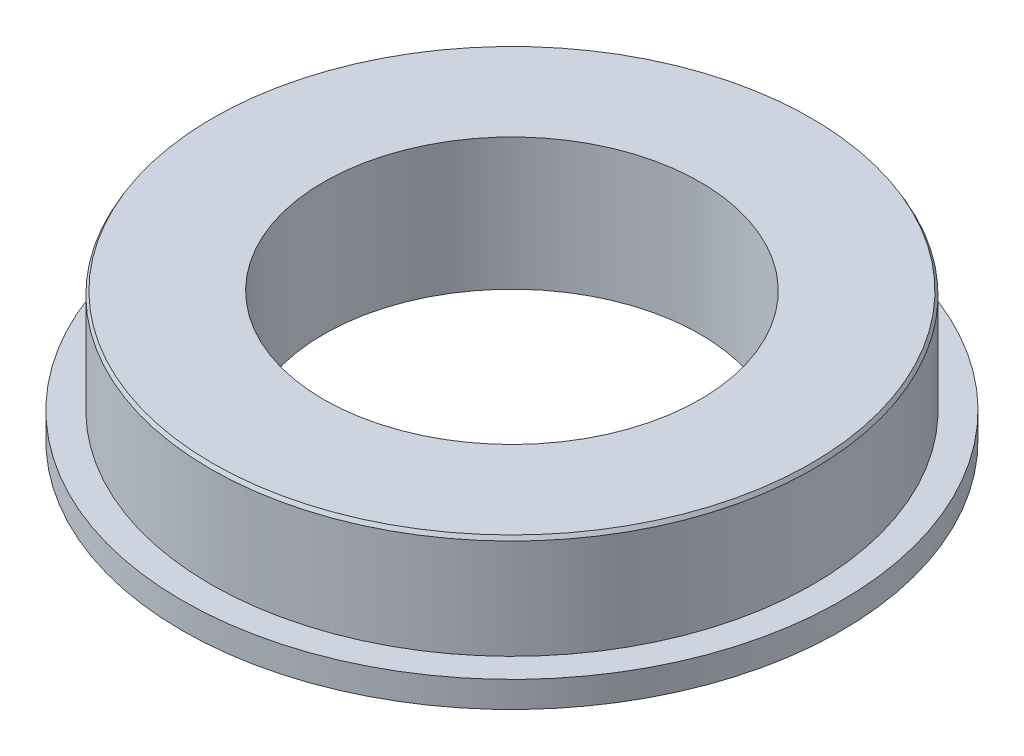
ISO-10303-21;
HEADER;
FILE_DESCRIPTION(('STEP AP214'),'2;1');
FILE_NAME('part.step','',(''),(''),'','','');
FILE_SCHEMA(('AUTOMOTIVE_DESIGN { 1 0 10303 214 1 1 1 1 }'));
ENDSEC;
DATA;
#1=APPLICATION_CONTEXT('core data for automotive mechanical design processes');
#2=APPLICATION_PROTOCOL_DEFINITION('international standard','automotive_design',2000,#1);
#3=PRODUCT_CONTEXT('',#1,'mechanical');
#4=PRODUCT('Part','Part','',(#3));
#5=PRODUCT_RELATED_PRODUCT_CATEGORY('part','',(#4));
#6=PRODUCT_DEFINITION_FORMATION('','',#4);
#7=PRODUCT_DEFINITION_CONTEXT('part definition',#1,'design');
#8=PRODUCT_DEFINITION('design','',#6,#7);
#9=PRODUCT_DEFINITION_SHAPE('','',#8);
#10=(LENGTH_UNIT() NAMED_UNIT(*) SI_UNIT(.MILLI.,.METRE.));
#11=(NAMED_UNIT(*) PLANE_ANGLE_UNIT() SI_UNIT($,.RADIAN.));
#12=(NAMED_UNIT(*) SI_UNIT($,.STERADIAN.) SOLID_ANGLE_UNIT());
#13=UNCERTAINTY_MEASURE_WITH_UNIT(LENGTH_MEASURE(1.E-05),#10,'distance_accuracy_value','');
#14=(GEOMETRIC_REPRESENTATION_CONTEXT(3) GLOBAL_UNCERTAINTY_ASSIGNED_CONTEXT((#13)) GLOBAL_UNIT_ASSIGNED_CONTEXT((#10,
#11,#12)) REPRESENTATION_CONTEXT('',''));
#15=CARTESIAN_POINT('',(0.,0.,0.));
#16=DIRECTION('',(0.,0.,1.));
#17=DIRECTION('',(1.,0.,0.));
#18=AXIS2_PLACEMENT_3D('',#15,#16,#17);
#19=CARTESIAN_POINT('',(0.,7.,0.));
#20=DIRECTION('',(0.,-1.,0.));
#21=DIRECTION('',(0.,0.,-1.));
#22=AXIS2_PLACEMENT_3D('',#19,#20,#21);
#23=CYLINDRICAL_SURFACE('',#22,10.);
#24=CARTESIAN_POINT('',(0.,7.,0.));
#25=DIRECTION('',(0.,1.,0.));
#26=DIRECTION('',(0.,0.,1.));
#27=AXIS2_PLACEMENT_3D('',#24,#25,#26);
#28=CIRCLE('',#27,10.);
#29=CARTESIAN_POINT('',(0.,7.,10.));
#30=VERTEX_POINT('',#29);
#31=EDGE_CURVE('E54',#30,#30,#28,.T.);
#32=ORIENTED_EDGE('',*,*,#31,.T.);
#33=EDGE_LOOP('',(#32));
#34=FACE_BOUND('',#33,.T.);
#35=CARTESIAN_POINT('',(0.,0.,0.));
#36=DIRECTION('',(0.,1.,0.));
#37=DIRECTION('',(0.,0.,1.));
#38=AXIS2_PLACEMENT_3D('',#35,#36,#37);
#39=CIRCLE('',#38,10.);
#40=CARTESIAN_POINT('',(0.,0.,10.));
#41=VERTEX_POINT('',#40);
#42=EDGE_CURVE('E55',#41,#41,#39,.T.);
#43=ORIENTED_EDGE('',*,*,#42,.F.);
#44=EDGE_LOOP('',(#43));
#45=FACE_BOUND('',#44,.T.);
#46=ADVANCED_FACE('F34',(#34,#45),#23,.F.);
#47=CARTESIAN_POINT('',(0.,7.,0.));
#48=DIRECTION('',(0.,-1.,0.));
#49=DIRECTION('',(0.,0.,-1.));
#50=AXIS2_PLACEMENT_3D('',#47,#48,#49);
#51=CYLINDRICAL_SURFACE('',#50,16.);
#52=CARTESIAN_POINT('',(0.,6.8,0.));
#53=DIRECTION('',(0.,1.,0.));
#54=DIRECTION('',(0.,0.,1.));
#55=AXIS2_PLACEMENT_3D('',#52,#53,#54);
#56=CIRCLE('',#55,16.);
#57=CARTESIAN_POINT('',(0.,6.8,16.));
#58=VERTEX_POINT('',#57);
#59=EDGE_CURVE('E10',#58,#58,#56,.F.);
#60=ORIENTED_EDGE('',*,*,#59,.T.);
#61=EDGE_LOOP('',(#60));
#62=FACE_BOUND('',#61,.T.);
#63=CARTESIAN_POINT('',(0.,1.5,0.));
#64=DIRECTION('',(0.,1.,0.));
#65=DIRECTION('',(0.,0.,1.));
#66=AXIS2_PLACEMENT_3D('',#63,#64,#65);
#67=CIRCLE('',#66,16.);
#68=CARTESIAN_POINT('',(0.,1.5,16.));
#69=VERTEX_POINT('',#68);
#70=EDGE_CURVE('E63',#69,#69,#67,.T.);
#71=ORIENTED_EDGE('',*,*,#70,.T.);
#72=EDGE_LOOP('',(#71));
#73=FACE_BOUND('',#72,.T.);
#74=ADVANCED_FACE('F67',(#62,#73),#51,.T.);
#75=CARTESIAN_POINT('',(0.,7.,0.));
#76=DIRECTION('',(0.,1.,0.));
#77=DIRECTION('',(0.,0.,1.));
#78=AXIS2_PLACEMENT_3D('',#75,#76,#77);
#79=PLANE('',#78);
#80=CARTESIAN_POINT('',(0.,7.,0.));
#81=DIRECTION('',(0.,1.,0.));
#82=DIRECTION('',(0.,0.,1.));
#83=AXIS2_PLACEMENT_3D('',#80,#81,#82);
#84=CIRCLE('',#83,15.8845299461621);
#85=CARTESIAN_POINT('',(0.,7.,15.8845299461621));
#86=VERTEX_POINT('',#85);
#87=EDGE_CURVE('E41',#86,#86,#84,.T.);
#88=ORIENTED_EDGE('',*,*,#87,.T.);
#89=EDGE_LOOP('',(#88));
#90=FACE_BOUND('',#89,.T.);
#91=ORIENTED_EDGE('',*,*,#31,.F.);
#92=EDGE_LOOP('',(#91));
#93=FACE_BOUND('',#92,.T.);
#94=ADVANCED_FACE('F84',(#90,#93),#79,.T.);
#95=CARTESIAN_POINT('',(0.,0.,0.));
#96=DIRECTION('',(0.,1.,0.));
#97=DIRECTION('',(0.,0.,1.));
#98=AXIS2_PLACEMENT_3D('',#95,#96,#97);
#99=PLANE('',#98);
#100=CARTESIAN_POINT('',(0.,0.,0.));
#101=DIRECTION('',(0.,1.,0.));
#102=DIRECTION('',(0.,0.,1.));
#103=AXIS2_PLACEMENT_3D('',#100,#101,#102);
#104=CIRCLE('',#103,17.3);
#105=CARTESIAN_POINT('',(0.,0.,17.3));
#106=VERTEX_POINT('',#105);
#107=EDGE_CURVE('E45',#106,#106,#104,.F.);
#108=ORIENTED_EDGE('',*,*,#107,.T.);
#109=EDGE_LOOP('',(#108));
#110=FACE_BOUND('',#109,.T.);
#111=ORIENTED_EDGE('',*,*,#42,.T.);
#112=EDGE_LOOP('',(#111));
#113=FACE_BOUND('',#112,.T.);
#114=ADVANCED_FACE('F78',(#110,#113),#99,.F.);
#115=CARTESIAN_POINT('',(0.,1.5,0.));
#116=DIRECTION('',(0.,-1.,0.));
#117=DIRECTION('',(0.,0.,-1.));
#118=AXIS2_PLACEMENT_3D('',#115,#116,#117);
#119=CYLINDRICAL_SURFACE('',#118,17.5);
#120=CARTESIAN_POINT('',(0.,0.115470053837925,0.));
#121=DIRECTION('',(0.,1.,0.));
#122=DIRECTION('',(0.,0.,1.));
#123=AXIS2_PLACEMENT_3D('',#120,#121,#122);
#124=CIRCLE('',#123,17.5);
#125=CARTESIAN_POINT('',(0.,0.115470053837925,17.5));
#126=VERTEX_POINT('',#125);
#127=EDGE_CURVE('E49',#126,#126,#124,.T.);
#128=ORIENTED_EDGE('',*,*,#127,.T.);
#129=EDGE_LOOP('',(#128));
#130=FACE_BOUND('',#129,.T.);
#131=CARTESIAN_POINT('',(0.,1.5,0.));
#132=DIRECTION('',(0.,1.,0.));
#133=DIRECTION('',(0.,0.,1.));
#134=AXIS2_PLACEMENT_3D('',#131,#132,#133);
#135=CIRCLE('',#134,17.5);
#136=CARTESIAN_POINT('',(0.,1.5,17.5));
#137=VERTEX_POINT('',#136);
#138=EDGE_CURVE('E58',#137,#137,#135,.T.);
#139=ORIENTED_EDGE('',*,*,#138,.F.);
#140=EDGE_LOOP('',(#139));
#141=FACE_BOUND('',#140,.T.);
#142=ADVANCED_FACE('F73',(#130,#141),#119,.T.);
#143=CARTESIAN_POINT('',(0.,1.5,0.));
#144=DIRECTION('',(0.,1.,0.));
#145=DIRECTION('',(0.,0.,1.));
#146=AXIS2_PLACEMENT_3D('',#143,#144,#145);
#147=PLANE('',#146);
#148=ORIENTED_EDGE('',*,*,#70,.F.);
#149=EDGE_LOOP('',(#148));
#150=FACE_BOUND('',#149,.T.);
#151=ORIENTED_EDGE('',*,*,#138,.T.);
#152=EDGE_LOOP('',(#151));
#153=FACE_BOUND('',#152,.T.);
#154=ADVANCED_FACE('F69',(#150,#153),#147,.T.);
#155=CARTESIAN_POINT('',(0.,0.115470053837925,0.));
#156=DIRECTION('',(0.,1.,0.));
#157=DIRECTION('',(0.,0.,1.));
#158=AXIS2_PLACEMENT_3D('',#155,#156,#157);
#159=CONICAL_SURFACE('',#158,17.5,1.0471975511966);
#160=CARTESIAN_POINT('',(0.,0.,17.3));
#161=CARTESIAN_POINT('',(0.,0.00120281306081136,17.3020833333333));
#162=CARTESIAN_POINT('',(0.,0.00240562612162325,17.3041666666667));
#163=CARTESIAN_POINT('',(0.,0.00481125224324703,17.3083333333333));
#164=CARTESIAN_POINT('',(0.,0.00601406530405892,17.3104166666667));
#165=CARTESIAN_POINT('',(0.,0.00841969142568217,17.3145833333333));
#166=CARTESIAN_POINT('',(0.,0.00962250448649353,17.3166666666667));
#167=CARTESIAN_POINT('',(0.,0.0120281306081169,17.3208333333333));
#168=CARTESIAN_POINT('',(0.,0.0132309436689288,17.3229166666667));
#169=CARTESIAN_POINT('',(0.,0.0156365697905524,17.3270833333333));
#170=CARTESIAN_POINT('',(0.,0.016839382851364,17.3291666666667));
#171=CARTESIAN_POINT('',(0.,0.0192450089729875,17.3333333333333));
#172=CARTESIAN_POINT('',(0.,0.0204478220337995,17.3354166666667));
#173=CARTESIAN_POINT('',(0.,0.0228534481554228,17.3395833333333));
#174=CARTESIAN_POINT('',(0.,0.0240562612162342,17.3416666666667));
#175=CARTESIAN_POINT('',(0.,0.0264618873378575,17.3458333333333));
#176=CARTESIAN_POINT('',(0.,0.0276647003986694,17.3479166666667));
#177=CARTESIAN_POINT('',(0.,0.030070326520293,17.3520833333333));
#178=CARTESIAN_POINT('',(0.,0.0312731395811047,17.3541666666667));
#179=CARTESIAN_POINT('',(0.,0.033678765702728,17.3583333333333));
#180=CARTESIAN_POINT('',(0.,0.0348815787635397,17.3604166666667));
#181=CARTESIAN_POINT('',(0.,0.0372872048851633,17.3645833333333));
#182=CARTESIAN_POINT('',(0.,0.0384900179459753,17.3666666666667));
#183=CARTESIAN_POINT('',(0.,0.0408956440675986,17.3708333333333));
#184=CARTESIAN_POINT('',(0.,0.0420984571284099,17.3729166666667));
#185=CARTESIAN_POINT('',(0.,0.0445040832500332,17.3770833333333));
#186=CARTESIAN_POINT('',(0.,0.0457068963108452,17.3791666666667));
#187=CARTESIAN_POINT('',(0.,0.0481125224324688,17.3833333333333));
#188=CARTESIAN_POINT('',(0.,0.0493153354932805,17.3854166666667));
#189=CARTESIAN_POINT('',(0.,0.0517209616149038,17.3895833333333));
#190=CARTESIAN_POINT('',(0.,0.0529237746757155,17.3916666666667));
#191=CARTESIAN_POINT('',(0.,0.0553294007973391,17.3958333333333));
#192=CARTESIAN_POINT('',(0.,0.056532213858151,17.3979166666667));
#193=CARTESIAN_POINT('',(0.,0.0589378399797743,17.4020833333333));
#194=CARTESIAN_POINT('',(0.,0.0601406530405857,17.4041666666667));
#195=CARTESIAN_POINT('',(0.,0.062546279162209,17.4083333333333));
#196=CARTESIAN_POINT('',(0.,0.063749092223021,17.4104166666667));
#197=CARTESIAN_POINT('',(0.,0.0661547183446445,17.4145833333333));
#198=CARTESIAN_POINT('',(0.,0.0673575314054561,17.4166666666667));
#199=CARTESIAN_POINT('',(0.,0.0697631575270797,17.4208333333333));
#200=CARTESIAN_POINT('',(0.,0.0709659705878917,17.4229166666667));
#201=CARTESIAN_POINT('',(0.,0.073371596709515,17.4270833333333));
#202=CARTESIAN_POINT('',(0.,0.0745744097703263,17.4291666666667));
#203=CARTESIAN_POINT('',(0.,0.0769800358919496,17.4333333333333));
#204=CARTESIAN_POINT('',(0.,0.0781828489527615,17.4354166666667));
#205=CARTESIAN_POINT('',(0.,0.0805884750743852,17.4395833333333));
#206=CARTESIAN_POINT('',(0.,0.0817912881351968,17.4416666666667));
#207=CARTESIAN_POINT('',(0.,0.0841969142568202,17.4458333333333));
#208=CARTESIAN_POINT('',(0.,0.0853997273176319,17.4479166666667));
#209=CARTESIAN_POINT('',(0.,0.0878053534392555,17.4520833333333));
#210=CARTESIAN_POINT('',(0.,0.0890081665000674,17.4541666666667));
#211=CARTESIAN_POINT('',(0.,0.0914137926216907,17.4583333333333));
#212=CARTESIAN_POINT('',(0.,0.0926166056825021,17.4604166666667));
#213=CARTESIAN_POINT('',(0.,0.0950222318041254,17.4645833333333));
#214=CARTESIAN_POINT('',(0.,0.0962250448649374,17.4666666666667));
#215=CARTESIAN_POINT('',(0.,0.0986306709865609,17.4708333333333));
#216=CARTESIAN_POINT('',(0.,0.0998334840473725,17.4729166666667));
#217=CARTESIAN_POINT('',(0.,0.102239110168996,17.4770833333333));
#218=CARTESIAN_POINT('',(0.,0.103441923229808,17.4791666666667));
#219=CARTESIAN_POINT('',(0.,0.105847549351431,17.4833333333333));
#220=CARTESIAN_POINT('',(0.,0.107050362412243,17.4854166666667));
#221=CARTESIAN_POINT('',(0.,0.109455988533866,17.4895833333333));
#222=CARTESIAN_POINT('',(0.,0.110658801594678,17.4916666666667));
#223=CARTESIAN_POINT('',(0.,0.113064427716302,17.4958333333333));
#224=CARTESIAN_POINT('',(0.,0.114267240777114,17.4979166666667));
#225=CARTESIAN_POINT('',(0.,0.115470053837925,17.5));
#226=B_SPLINE_CURVE_WITH_KNOTS('',3,(#160,#161,#162,#163,#164,#165,#166,#167,#168,#169,#170,
#171,#172,#173,#174,#175,#176,#177,#178,#179,#180,#181,#182,#183,#184,#185,#186,#187,#188,#189,
#190,#191,#192,#193,#194,#195,#196,#197,#198,#199,#200,#201,#202,#203,#204,#205,#206,#207,#208,
#209,#210,#211,#212,#213,#214,#215,#216,#217,#218,#219,#220,#221,#222,#223,#224,#225),
.UNSPECIFIED.,.F.,.F.,(4,2,2,2,2,2,2,2,2,2,2,2,2,2,2,2,2,2,2,2,2,2,2,2,2,2,2,2,2,2,2,2,4),(0.,
0.00721687836486972,0.0144337567297394,0.0216506350946122,0.0288675134594819,0.0360843918243516,
0.0433012701892213,0.0505181485540941,0.0577350269189638,0.0649519052838335,0.0721687836487032,
0.0793856620135729,0.0866025403784457,0.0938194187433154,0.101036297108185,0.108253175473055,
0.115470053837925,0.122686932202797,0.129903810567667,0.137120688932537,0.144337567297406,
0.151554445662279,0.158771324027149,0.165988202392019,0.173205080756888,0.180421959121758,
0.187638837486631,0.1948557158515,0.20207259421637,0.20928947258124,0.216506350946113,
0.223723229310982,0.230940107675852),.UNSPECIFIED.);
#227=EDGE_CURVE('BSEAM72',#106,#126,#226,.T.);
#228=ORIENTED_EDGE('',*,*,#107,.F.);
#229=ORIENTED_EDGE('',*,*,#127,.F.);
#230=ORIENTED_EDGE('',*,*,#227,.T.);
#231=ORIENTED_EDGE('',*,*,#227,.F.);
#232=EDGE_LOOP('',(#228,#230,#229,#231));
#233=FACE_BOUND('',#232,.T.);
#234=ADVANCED_FACE('F72',(#233),#159,.T.);
#235=CARTESIAN_POINT('',(0.,7.,0.));
#236=DIRECTION('',(0.,-1.,0.));
#237=DIRECTION('',(0.,0.,-1.));
#238=AXIS2_PLACEMENT_3D('',#235,#236,#237);
#239=CONICAL_SURFACE('',#238,15.8845299461621,0.523598775598294);
#240=ORIENTED_EDGE('',*,*,#59,.F.);
#241=EDGE_LOOP('',(#240));
#242=FACE_BOUND('',#241,.T.);
#243=ORIENTED_EDGE('',*,*,#87,.F.);
#244=EDGE_LOOP('',(#243));
#245=FACE_BOUND('',#244,.T.);
#246=ADVANCED_FACE('F36',(#242,#245),#239,.T.);
#247=CLOSED_SHELL('',(#46,#74,#94,#114,#142,#154,#234,#246));
#248=MANIFOLD_SOLID_BREP('B2',#247);
#249=ADVANCED_BREP_SHAPE_REPRESENTATION('',(#18,#248),#14);
#250=SHAPE_DEFINITION_REPRESENTATION(#9,#249);
ENDSEC;
END-ISO-10303-21;
